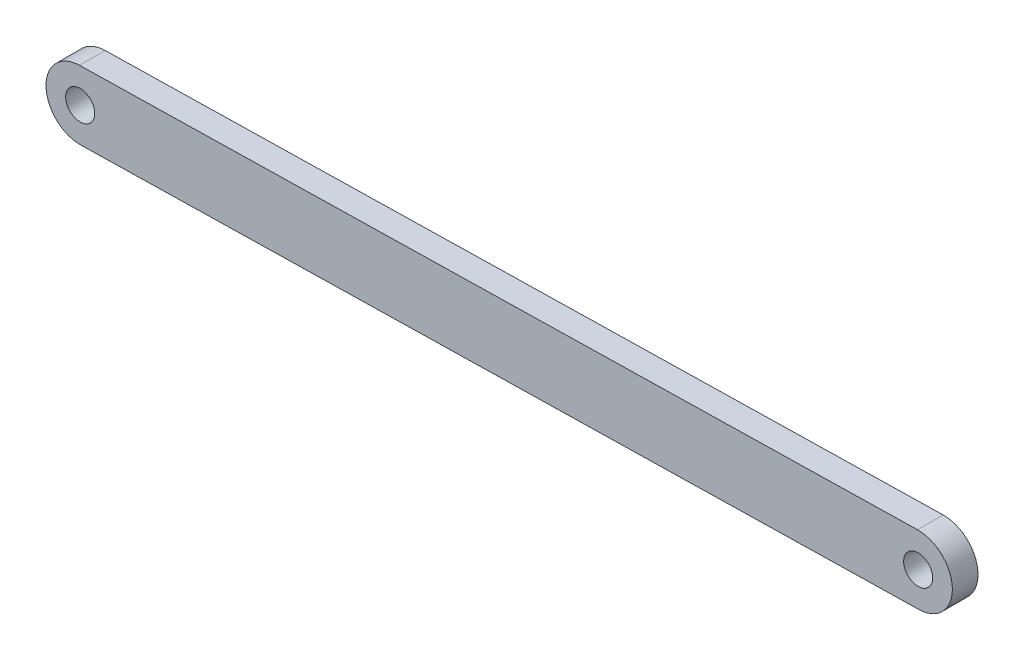
ISO-10303-21;
HEADER;
FILE_DESCRIPTION(('STEP AP214'),'2;1');
FILE_NAME('part.step','',(''),(''),'','','');
FILE_SCHEMA(('AUTOMOTIVE_DESIGN { 1 0 10303 214 1 1 1 1 }'));
ENDSEC;
DATA;
#1=APPLICATION_CONTEXT('core data for automotive mechanical design processes');
#2=APPLICATION_PROTOCOL_DEFINITION('international standard','automotive_design',2000,#1);
#3=PRODUCT_CONTEXT('',#1,'mechanical');
#4=PRODUCT('Part','Part','',(#3));
#5=PRODUCT_RELATED_PRODUCT_CATEGORY('part','',(#4));
#6=PRODUCT_DEFINITION_FORMATION('','',#4);
#7=PRODUCT_DEFINITION_CONTEXT('part definition',#1,'design');
#8=PRODUCT_DEFINITION('design','',#6,#7);
#9=PRODUCT_DEFINITION_SHAPE('','',#8);
#10=(LENGTH_UNIT() NAMED_UNIT(*) SI_UNIT(.MILLI.,.METRE.));
#11=(NAMED_UNIT(*) PLANE_ANGLE_UNIT() SI_UNIT($,.RADIAN.));
#12=(NAMED_UNIT(*) SI_UNIT($,.STERADIAN.) SOLID_ANGLE_UNIT());
#13=UNCERTAINTY_MEASURE_WITH_UNIT(LENGTH_MEASURE(1.E-05),#10,'distance_accuracy_value','');
#14=(GEOMETRIC_REPRESENTATION_CONTEXT(3) GLOBAL_UNCERTAINTY_ASSIGNED_CONTEXT((#13)) GLOBAL_UNIT_ASSIGNED_CONTEXT((#10,
#11,#12)) REPRESENTATION_CONTEXT('',''));
#15=CARTESIAN_POINT('',(0.,0.,0.));
#16=DIRECTION('',(0.,0.,1.));
#17=DIRECTION('',(1.,0.,0.));
#18=AXIS2_PLACEMENT_3D('',#15,#16,#17);
#19=CARTESIAN_POINT('',(-12.0813288302025,0.848648635558724,3.));
#20=DIRECTION('',(0.,0.,1.));
#21=DIRECTION('',(1.,0.,0.));
#22=AXIS2_PLACEMENT_3D('',#19,#20,#21);
#23=PLANE('',#22);
#24=CARTESIAN_POINT('',(-12.0813288302025,0.848648635558724,3.));
#25=DIRECTION('',(0.,0.,1.));
#26=DIRECTION('',(1.,0.,0.));
#27=AXIS2_PLACEMENT_3D('',#24,#25,#26);
#28=CIRCLE('',#27,1.69999999999999);
#29=CARTESIAN_POINT('',(-10.3813288302025,0.848648635558724,3.));
#30=VERTEX_POINT('',#29);
#31=EDGE_CURVE('E134',#30,#30,#28,.T.);
#32=ORIENTED_EDGE('',*,*,#31,.F.);
#33=EDGE_LOOP('',(#32));
#34=FACE_BOUND('',#33,.T.);
#35=CARTESIAN_POINT('',(-12.0813288302025,0.848648635558724,3.));
#36=DIRECTION('',(0.,0.,1.));
#37=DIRECTION('',(1.,0.,0.));
#38=AXIS2_PLACEMENT_3D('',#35,#36,#37);
#39=CIRCLE('',#38,4.);
#40=CARTESIAN_POINT('',(-12.1614742101629,4.84784564471831,3.));
#41=VERTEX_POINT('',#40);
#42=CARTESIAN_POINT('',(-12.0011834502421,-3.15054837360087,3.));
#43=VERTEX_POINT('',#42);
#44=EDGE_CURVE('E112',#41,#43,#39,.T.);
#45=ORIENTED_EDGE('',*,*,#44,.T.);
#46=DIRECTION('',(0.999799252289897,0.0200363449901051,0.));
#47=VECTOR('',#46,1.);
#48=CARTESIAN_POINT('',(-12.0011834502421,-3.15054837360087,3.));
#49=LINE('',#48,#47);
#50=CARTESIAN_POINT('',(85.9968768377601,-1.18663117742938,3.));
#51=VERTEX_POINT('',#50);
#52=EDGE_CURVE('E107',#43,#51,#49,.T.);
#53=ORIENTED_EDGE('',*,*,#52,.T.);
#54=CARTESIAN_POINT('',(85.9167314577996,2.81256583173022,3.));
#55=DIRECTION('',(0.,0.,1.));
#56=DIRECTION('',(1.,0.,0.));
#57=AXIS2_PLACEMENT_3D('',#54,#55,#56);
#58=CIRCLE('',#57,4.);
#59=CARTESIAN_POINT('',(85.8365860778392,6.81176284088981,3.));
#60=VERTEX_POINT('',#59);
#61=EDGE_CURVE('E110',#51,#60,#58,.T.);
#62=ORIENTED_EDGE('',*,*,#61,.T.);
#63=DIRECTION('',(-0.999799252289897,-0.0200363449901051,0.));
#64=VECTOR('',#63,1.);
#65=CARTESIAN_POINT('',(-12.1614742101629,4.84784564471831,3.));
#66=LINE('',#65,#64);
#67=EDGE_CURVE('E71',#60,#41,#66,.T.);
#68=ORIENTED_EDGE('',*,*,#67,.T.);
#69=EDGE_LOOP('',(#45,#53,#62,#68));
#70=FACE_BOUND('',#69,.T.);
#71=CARTESIAN_POINT('',(85.9167314577996,2.81256583173022,3.));
#72=DIRECTION('',(0.,0.,1.));
#73=DIRECTION('',(1.,0.,0.));
#74=AXIS2_PLACEMENT_3D('',#71,#72,#73);
#75=CIRCLE('',#74,1.7);
#76=CARTESIAN_POINT('',(87.6167314577996,2.81256583173022,3.));
#77=VERTEX_POINT('',#76);
#78=EDGE_CURVE('E157',#77,#77,#75,.T.);
#79=ORIENTED_EDGE('',*,*,#78,.F.);
#80=EDGE_LOOP('',(#79));
#81=FACE_BOUND('',#80,.T.);
#82=ADVANCED_FACE('F51',(#34,#70,#81),#23,.T.);
#83=CARTESIAN_POINT('',(-12.0813288302025,0.848648635558724,0.));
#84=DIRECTION('',(0.,0.,1.));
#85=DIRECTION('',(1.,0.,0.));
#86=AXIS2_PLACEMENT_3D('',#83,#84,#85);
#87=PLANE('',#86);
#88=CARTESIAN_POINT('',(-12.0813288302025,0.848648635558724,0.));
#89=DIRECTION('',(0.,0.,1.));
#90=DIRECTION('',(1.,0.,0.));
#91=AXIS2_PLACEMENT_3D('',#88,#89,#90);
#92=CIRCLE('',#91,4.);
#93=CARTESIAN_POINT('',(-12.1614742101629,4.84784564471831,0.));
#94=VERTEX_POINT('',#93);
#95=CARTESIAN_POINT('',(-12.0011834502421,-3.15054837360087,0.));
#96=VERTEX_POINT('',#95);
#97=EDGE_CURVE('E131',#94,#96,#92,.T.);
#98=ORIENTED_EDGE('',*,*,#97,.F.);
#99=DIRECTION('',(-0.999799252289897,-0.0200363449901051,0.));
#100=VECTOR('',#99,1.);
#101=CARTESIAN_POINT('',(-12.1614742101629,4.84784564471831,0.));
#102=LINE('',#101,#100);
#103=CARTESIAN_POINT('',(85.8365860778392,6.81176284088981,0.));
#104=VERTEX_POINT('',#103);
#105=EDGE_CURVE('E100',#104,#94,#102,.T.);
#106=ORIENTED_EDGE('',*,*,#105,.F.);
#107=CARTESIAN_POINT('',(85.9167314577996,2.81256583173022,0.));
#108=DIRECTION('',(0.,0.,1.));
#109=DIRECTION('',(1.,0.,0.));
#110=AXIS2_PLACEMENT_3D('',#107,#108,#109);
#111=CIRCLE('',#110,4.);
#112=CARTESIAN_POINT('',(85.9968768377601,-1.18663117742938,0.));
#113=VERTEX_POINT('',#112);
#114=EDGE_CURVE('E92',#113,#104,#111,.T.);
#115=ORIENTED_EDGE('',*,*,#114,.F.);
#116=DIRECTION('',(0.999799252289897,0.0200363449901051,0.));
#117=VECTOR('',#116,1.);
#118=CARTESIAN_POINT('',(-12.0011834502421,-3.15054837360087,0.));
#119=LINE('',#118,#117);
#120=EDGE_CURVE('E117',#96,#113,#119,.T.);
#121=ORIENTED_EDGE('',*,*,#120,.F.);
#122=EDGE_LOOP('',(#98,#106,#115,#121));
#123=FACE_BOUND('',#122,.T.);
#124=CARTESIAN_POINT('',(-12.0813288302025,0.848648635558724,0.));
#125=DIRECTION('',(0.,0.,1.));
#126=DIRECTION('',(1.,0.,0.));
#127=AXIS2_PLACEMENT_3D('',#124,#125,#126);
#128=CIRCLE('',#127,1.69999999999999);
#129=CARTESIAN_POINT('',(-10.3813288302025,0.848648635558724,0.));
#130=VERTEX_POINT('',#129);
#131=EDGE_CURVE('E153',#130,#130,#128,.T.);
#132=ORIENTED_EDGE('',*,*,#131,.T.);
#133=EDGE_LOOP('',(#132));
#134=FACE_BOUND('',#133,.T.);
#135=CARTESIAN_POINT('',(85.9167314577996,2.81256583173022,0.));
#136=DIRECTION('',(0.,0.,1.));
#137=DIRECTION('',(1.,0.,0.));
#138=AXIS2_PLACEMENT_3D('',#135,#136,#137);
#139=CIRCLE('',#138,1.7);
#140=CARTESIAN_POINT('',(87.6167314577996,2.81256583173022,0.));
#141=VERTEX_POINT('',#140);
#142=EDGE_CURVE('E161',#141,#141,#139,.T.);
#143=ORIENTED_EDGE('',*,*,#142,.T.);
#144=EDGE_LOOP('',(#143));
#145=FACE_BOUND('',#144,.T.);
#146=ADVANCED_FACE('F147',(#123,#134,#145),#87,.F.);
#147=CARTESIAN_POINT('',(-12.0813288302025,0.848648635558724,3.));
#148=DIRECTION('',(0.,0.,-1.));
#149=DIRECTION('',(-1.,0.,0.));
#150=AXIS2_PLACEMENT_3D('',#147,#148,#149);
#151=CYLINDRICAL_SURFACE('',#150,4.);
#152=ORIENTED_EDGE('',*,*,#97,.T.);
#153=DIRECTION('',(0.,0.,-1.));
#154=VECTOR('',#153,1.);
#155=CARTESIAN_POINT('',(-12.0011834502421,-3.15054837360087,3.));
#156=LINE('',#155,#154);
#157=EDGE_CURVE('E11',#43,#96,#156,.T.);
#158=ORIENTED_EDGE('',*,*,#157,.F.);
#159=ORIENTED_EDGE('',*,*,#44,.F.);
#160=DIRECTION('',(0.,0.,-1.));
#161=VECTOR('',#160,1.);
#162=CARTESIAN_POINT('',(-12.1614742101629,4.84784564471831,3.));
#163=LINE('',#162,#161);
#164=EDGE_CURVE('E127',#41,#94,#163,.T.);
#165=ORIENTED_EDGE('',*,*,#164,.T.);
#166=EDGE_LOOP('',(#152,#158,#159,#165));
#167=FACE_BOUND('',#166,.T.);
#168=ADVANCED_FACE('F53',(#167),#151,.T.);
#169=CARTESIAN_POINT('',(-12.0011834502421,-3.15054837360087,3.));
#170=DIRECTION('',(-0.0200363449901051,0.999799252289897,0.));
#171=DIRECTION('',(-0.999799252289897,-0.0200363449901051,0.));
#172=AXIS2_PLACEMENT_3D('',#169,#170,#171);
#173=PLANE('',#172);
#174=ORIENTED_EDGE('',*,*,#120,.T.);
#175=DIRECTION('',(0.,0.,-1.));
#176=VECTOR('',#175,1.);
#177=CARTESIAN_POINT('',(85.9968768377601,-1.18663117742938,3.));
#178=LINE('',#177,#176);
#179=EDGE_CURVE('E61',#51,#113,#178,.T.);
#180=ORIENTED_EDGE('',*,*,#179,.F.);
#181=ORIENTED_EDGE('',*,*,#52,.F.);
#182=ORIENTED_EDGE('',*,*,#157,.T.);
#183=EDGE_LOOP('',(#174,#180,#181,#182));
#184=FACE_BOUND('',#183,.T.);
#185=ADVANCED_FACE('F116',(#184),#173,.F.);
#186=CARTESIAN_POINT('',(85.9167314577996,2.81256583173022,3.));
#187=DIRECTION('',(0.,0.,-1.));
#188=DIRECTION('',(-1.,0.,0.));
#189=AXIS2_PLACEMENT_3D('',#186,#187,#188);
#190=CYLINDRICAL_SURFACE('',#189,4.);
#191=ORIENTED_EDGE('',*,*,#114,.T.);
#192=DIRECTION('',(0.,0.,-1.));
#193=VECTOR('',#192,1.);
#194=CARTESIAN_POINT('',(85.8365860778392,6.81176284088981,3.));
#195=LINE('',#194,#193);
#196=EDGE_CURVE('E119',#60,#104,#195,.T.);
#197=ORIENTED_EDGE('',*,*,#196,.F.);
#198=ORIENTED_EDGE('',*,*,#61,.F.);
#199=ORIENTED_EDGE('',*,*,#179,.T.);
#200=EDGE_LOOP('',(#191,#197,#198,#199));
#201=FACE_BOUND('',#200,.T.);
#202=ADVANCED_FACE('F120',(#201),#190,.T.);
#203=CARTESIAN_POINT('',(-12.1614742101629,4.84784564471831,3.));
#204=DIRECTION('',(0.0200363449901051,-0.999799252289897,0.));
#205=DIRECTION('',(0.999799252289897,0.0200363449901051,0.));
#206=AXIS2_PLACEMENT_3D('',#203,#204,#205);
#207=PLANE('',#206);
#208=ORIENTED_EDGE('',*,*,#105,.T.);
#209=ORIENTED_EDGE('',*,*,#164,.F.);
#210=ORIENTED_EDGE('',*,*,#67,.F.);
#211=ORIENTED_EDGE('',*,*,#196,.T.);
#212=EDGE_LOOP('',(#208,#209,#210,#211));
#213=FACE_BOUND('',#212,.T.);
#214=ADVANCED_FACE('F144',(#213),#207,.F.);
#215=CARTESIAN_POINT('',(-12.0813288302025,0.848648635558724,3.));
#216=DIRECTION('',(0.,0.,-1.));
#217=DIRECTION('',(-1.,0.,0.));
#218=AXIS2_PLACEMENT_3D('',#215,#216,#217);
#219=CYLINDRICAL_SURFACE('',#218,1.69999999999999);
#220=ORIENTED_EDGE('',*,*,#31,.T.);
#221=EDGE_LOOP('',(#220));
#222=FACE_BOUND('',#221,.T.);
#223=ORIENTED_EDGE('',*,*,#131,.F.);
#224=EDGE_LOOP('',(#223));
#225=FACE_BOUND('',#224,.T.);
#226=ADVANCED_FACE('F181',(#222,#225),#219,.F.);
#227=CARTESIAN_POINT('',(85.9167314577996,2.81256583173022,3.));
#228=DIRECTION('',(0.,0.,-1.));
#229=DIRECTION('',(-1.,0.,0.));
#230=AXIS2_PLACEMENT_3D('',#227,#228,#229);
#231=CYLINDRICAL_SURFACE('',#230,1.7);
#232=ORIENTED_EDGE('',*,*,#78,.T.);
#233=EDGE_LOOP('',(#232));
#234=FACE_BOUND('',#233,.T.);
#235=ORIENTED_EDGE('',*,*,#142,.F.);
#236=EDGE_LOOP('',(#235));
#237=FACE_BOUND('',#236,.T.);
#238=ADVANCED_FACE('F170',(#234,#237),#231,.F.);
#239=CLOSED_SHELL('',(#82,#146,#168,#185,#202,#214,#226,#238));
#240=MANIFOLD_SOLID_BREP('B2',#239);
#241=ADVANCED_BREP_SHAPE_REPRESENTATION('',(#18,#240),#14);
#242=SHAPE_DEFINITION_REPRESENTATION(#9,#241);
ENDSEC;
END-ISO-10303-21;
